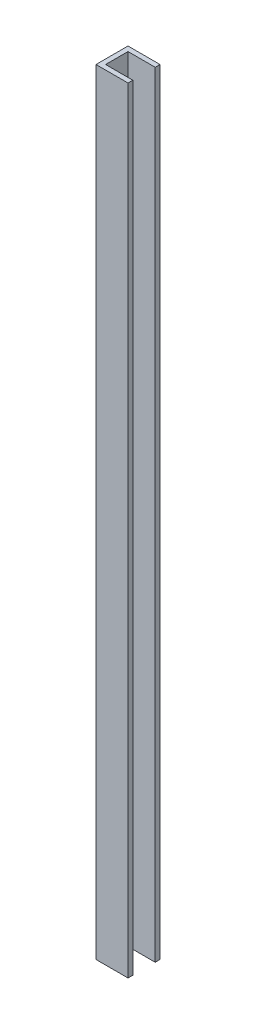
ISO-10303-21;
HEADER;
FILE_DESCRIPTION(('STEP AP214'),'2;1');
FILE_NAME('part.step','',(''),(''),'','','');
FILE_SCHEMA(('AUTOMOTIVE_DESIGN { 1 0 10303 214 1 1 1 1 }'));
ENDSEC;
DATA;
#1=APPLICATION_CONTEXT('core data for automotive mechanical design processes');
#2=APPLICATION_PROTOCOL_DEFINITION('international standard','automotive_design',2000,#1);
#3=PRODUCT_CONTEXT('',#1,'mechanical');
#4=PRODUCT('Part','Part','',(#3));
#5=PRODUCT_RELATED_PRODUCT_CATEGORY('part','',(#4));
#6=PRODUCT_DEFINITION_FORMATION('','',#4);
#7=PRODUCT_DEFINITION_CONTEXT('part definition',#1,'design');
#8=PRODUCT_DEFINITION('design','',#6,#7);
#9=PRODUCT_DEFINITION_SHAPE('','',#8);
#10=(LENGTH_UNIT() NAMED_UNIT(*) SI_UNIT(.MILLI.,.METRE.));
#11=(NAMED_UNIT(*) PLANE_ANGLE_UNIT() SI_UNIT($,.RADIAN.));
#12=(NAMED_UNIT(*) SI_UNIT($,.STERADIAN.) SOLID_ANGLE_UNIT());
#13=UNCERTAINTY_MEASURE_WITH_UNIT(LENGTH_MEASURE(1.E-05),#10,'distance_accuracy_value','');
#14=(GEOMETRIC_REPRESENTATION_CONTEXT(3) GLOBAL_UNCERTAINTY_ASSIGNED_CONTEXT((#13)) GLOBAL_UNIT_ASSIGNED_CONTEXT((#10,
#11,#12)) REPRESENTATION_CONTEXT('',''));
#15=CARTESIAN_POINT('',(0.,0.,0.));
#16=DIRECTION('',(0.,0.,1.));
#17=DIRECTION('',(1.,0.,0.));
#18=AXIS2_PLACEMENT_3D('',#15,#16,#17);
#19=CARTESIAN_POINT('',(-3.5,121.,0.));
#20=DIRECTION('',(1.,0.,0.));
#21=DIRECTION('',(0.,0.,-1.));
#22=AXIS2_PLACEMENT_3D('',#19,#20,#21);
#23=PLANE('',#22);
#24=DIRECTION('',(0.,0.,1.));
#25=VECTOR('',#24,1.);
#26=CARTESIAN_POINT('',(-3.5,-121.,0.));
#27=LINE('',#26,#25);
#28=CARTESIAN_POINT('',(-3.5,-121.,-3.50000000000002));
#29=VERTEX_POINT('',#28);
#30=CARTESIAN_POINT('',(-3.5,-121.,3.50000000000001));
#31=VERTEX_POINT('',#30);
#32=EDGE_CURVE('E195',#29,#31,#27,.T.);
#33=ORIENTED_EDGE('',*,*,#32,.F.);
#34=DIRECTION('',(0.,-1.,0.));
#35=VECTOR('',#34,1.);
#36=CARTESIAN_POINT('',(-3.5,121.,-3.50000000000002));
#37=LINE('',#36,#35);
#38=CARTESIAN_POINT('',(-3.5,121.,-3.50000000000002));
#39=VERTEX_POINT('',#38);
#40=EDGE_CURVE('E11',#39,#29,#37,.T.);
#41=ORIENTED_EDGE('',*,*,#40,.F.);
#42=DIRECTION('',(0.,0.,1.));
#43=VECTOR('',#42,1.);
#44=CARTESIAN_POINT('',(-3.5,121.,0.));
#45=LINE('',#44,#43);
#46=CARTESIAN_POINT('',(-3.5,121.,3.50000000000001));
#47=VERTEX_POINT('',#46);
#48=EDGE_CURVE('E151',#39,#47,#45,.T.);
#49=ORIENTED_EDGE('',*,*,#48,.T.);
#50=DIRECTION('',(0.,-1.,0.));
#51=VECTOR('',#50,1.);
#52=CARTESIAN_POINT('',(-3.5,121.,3.50000000000001));
#53=LINE('',#52,#51);
#54=EDGE_CURVE('E95',#47,#31,#53,.T.);
#55=ORIENTED_EDGE('',*,*,#54,.T.);
#56=EDGE_LOOP('',(#33,#41,#49,#55));
#57=FACE_BOUND('',#56,.T.);
#58=ADVANCED_FACE('F43',(#57),#23,.T.);
#59=CARTESIAN_POINT('',(0.,121.,-3.50000000000002));
#60=DIRECTION('',(0.,0.,1.));
#61=DIRECTION('',(1.,0.,0.));
#62=AXIS2_PLACEMENT_3D('',#59,#60,#61);
#63=PLANE('',#62);
#64=DIRECTION('',(-1.,0.,0.));
#65=VECTOR('',#64,1.);
#66=CARTESIAN_POINT('',(0.,-121.,-3.50000000000002));
#67=LINE('',#66,#65);
#68=CARTESIAN_POINT('',(5.,-121.,-3.50000000000002));
#69=VERTEX_POINT('',#68);
#70=EDGE_CURVE('E188',#69,#29,#67,.T.);
#71=ORIENTED_EDGE('',*,*,#70,.F.);
#72=DIRECTION('',(0.,-1.,0.));
#73=VECTOR('',#72,1.);
#74=CARTESIAN_POINT('',(5.,121.,-3.50000000000002));
#75=LINE('',#74,#73);
#76=CARTESIAN_POINT('',(5.,121.,-3.50000000000002));
#77=VERTEX_POINT('',#76);
#78=EDGE_CURVE('E52',#77,#69,#75,.T.);
#79=ORIENTED_EDGE('',*,*,#78,.F.);
#80=DIRECTION('',(-1.,0.,0.));
#81=VECTOR('',#80,1.);
#82=CARTESIAN_POINT('',(0.,121.,-3.50000000000002));
#83=LINE('',#82,#81);
#84=EDGE_CURVE('E143',#77,#39,#83,.T.);
#85=ORIENTED_EDGE('',*,*,#84,.T.);
#86=ORIENTED_EDGE('',*,*,#40,.T.);
#87=EDGE_LOOP('',(#71,#79,#85,#86));
#88=FACE_BOUND('',#87,.T.);
#89=ADVANCED_FACE('F193',(#88),#63,.T.);
#90=CARTESIAN_POINT('',(5.,121.,0.));
#91=DIRECTION('',(-1.,0.,0.));
#92=DIRECTION('',(0.,0.,1.));
#93=AXIS2_PLACEMENT_3D('',#90,#91,#92);
#94=PLANE('',#93);
#95=DIRECTION('',(0.,0.,-1.));
#96=VECTOR('',#95,1.);
#97=CARTESIAN_POINT('',(5.,-121.,0.));
#98=LINE('',#97,#96);
#99=CARTESIAN_POINT('',(5.,-121.,-5.00000000000002));
#100=VERTEX_POINT('',#99);
#101=EDGE_CURVE('E163',#69,#100,#98,.T.);
#102=ORIENTED_EDGE('',*,*,#101,.T.);
#103=DIRECTION('',(0.,-1.,0.));
#104=VECTOR('',#103,1.);
#105=CARTESIAN_POINT('',(5.,121.,-5.00000000000002));
#106=LINE('',#105,#104);
#107=CARTESIAN_POINT('',(5.,121.,-5.00000000000002));
#108=VERTEX_POINT('',#107);
#109=EDGE_CURVE('E176',#108,#100,#106,.T.);
#110=ORIENTED_EDGE('',*,*,#109,.F.);
#111=DIRECTION('',(0.,0.,-1.));
#112=VECTOR('',#111,1.);
#113=CARTESIAN_POINT('',(5.,121.,0.));
#114=LINE('',#113,#112);
#115=EDGE_CURVE('E136',#77,#108,#114,.T.);
#116=ORIENTED_EDGE('',*,*,#115,.F.);
#117=ORIENTED_EDGE('',*,*,#78,.T.);
#118=EDGE_LOOP('',(#102,#110,#116,#117));
#119=FACE_BOUND('',#118,.T.);
#120=ADVANCED_FACE('F182',(#119),#94,.F.);
#121=CARTESIAN_POINT('',(0.,121.,-5.00000000000002));
#122=DIRECTION('',(0.,0.,-1.));
#123=DIRECTION('',(-1.,0.,0.));
#124=AXIS2_PLACEMENT_3D('',#121,#122,#123);
#125=PLANE('',#124);
#126=DIRECTION('',(1.,0.,0.));
#127=VECTOR('',#126,1.);
#128=CARTESIAN_POINT('',(0.,-121.,-5.00000000000002));
#129=LINE('',#128,#127);
#130=CARTESIAN_POINT('',(-5.,-121.,-5.00000000000002));
#131=VERTEX_POINT('',#130);
#132=EDGE_CURVE('E191',#131,#100,#129,.T.);
#133=ORIENTED_EDGE('',*,*,#132,.F.);
#134=DIRECTION('',(0.,-1.,0.));
#135=VECTOR('',#134,1.);
#136=CARTESIAN_POINT('',(-5.,121.,-5.00000000000002));
#137=LINE('',#136,#135);
#138=CARTESIAN_POINT('',(-5.,121.,-5.00000000000002));
#139=VERTEX_POINT('',#138);
#140=EDGE_CURVE('E173',#139,#131,#137,.T.);
#141=ORIENTED_EDGE('',*,*,#140,.F.);
#142=DIRECTION('',(1.,0.,0.));
#143=VECTOR('',#142,1.);
#144=CARTESIAN_POINT('',(0.,121.,-5.00000000000002));
#145=LINE('',#144,#143);
#146=EDGE_CURVE('E142',#139,#108,#145,.T.);
#147=ORIENTED_EDGE('',*,*,#146,.T.);
#148=ORIENTED_EDGE('',*,*,#109,.T.);
#149=EDGE_LOOP('',(#133,#141,#147,#148));
#150=FACE_BOUND('',#149,.T.);
#151=ADVANCED_FACE('F208',(#150),#125,.T.);
#152=CARTESIAN_POINT('',(-5.,121.,0.));
#153=DIRECTION('',(-1.,0.,0.));
#154=DIRECTION('',(0.,0.,1.));
#155=AXIS2_PLACEMENT_3D('',#152,#153,#154);
#156=PLANE('',#155);
#157=DIRECTION('',(0.,0.,-1.));
#158=VECTOR('',#157,1.);
#159=CARTESIAN_POINT('',(-5.,-121.,0.));
#160=LINE('',#159,#158);
#161=CARTESIAN_POINT('',(-5.,-121.,5.00000000000002));
#162=VERTEX_POINT('',#161);
#163=EDGE_CURVE('E201',#162,#131,#160,.T.);
#164=ORIENTED_EDGE('',*,*,#163,.F.);
#165=DIRECTION('',(0.,-1.,0.));
#166=VECTOR('',#165,1.);
#167=CARTESIAN_POINT('',(-5.,121.,5.00000000000002));
#168=LINE('',#167,#166);
#169=CARTESIAN_POINT('',(-5.,121.,5.00000000000002));
#170=VERTEX_POINT('',#169);
#171=EDGE_CURVE('E130',#170,#162,#168,.T.);
#172=ORIENTED_EDGE('',*,*,#171,.F.);
#173=DIRECTION('',(0.,0.,-1.));
#174=VECTOR('',#173,1.);
#175=CARTESIAN_POINT('',(-5.,121.,0.));
#176=LINE('',#175,#174);
#177=EDGE_CURVE('E121',#170,#139,#176,.T.);
#178=ORIENTED_EDGE('',*,*,#177,.T.);
#179=ORIENTED_EDGE('',*,*,#140,.T.);
#180=EDGE_LOOP('',(#164,#172,#178,#179));
#181=FACE_BOUND('',#180,.T.);
#182=ADVANCED_FACE('F206',(#181),#156,.T.);
#183=CARTESIAN_POINT('',(0.,121.,5.00000000000002));
#184=DIRECTION('',(0.,0.,-1.));
#185=DIRECTION('',(-1.,0.,0.));
#186=AXIS2_PLACEMENT_3D('',#183,#184,#185);
#187=PLANE('',#186);
#188=DIRECTION('',(1.,0.,0.));
#189=VECTOR('',#188,1.);
#190=CARTESIAN_POINT('',(0.,-121.,5.00000000000002));
#191=LINE('',#190,#189);
#192=CARTESIAN_POINT('',(5.,-121.,5.00000000000002));
#193=VERTEX_POINT('',#192);
#194=EDGE_CURVE('E128',#162,#193,#191,.T.);
#195=ORIENTED_EDGE('',*,*,#194,.T.);
#196=DIRECTION('',(0.,-1.,0.));
#197=VECTOR('',#196,1.);
#198=CARTESIAN_POINT('',(5.,121.,5.00000000000002));
#199=LINE('',#198,#197);
#200=CARTESIAN_POINT('',(5.,121.,5.00000000000002));
#201=VERTEX_POINT('',#200);
#202=EDGE_CURVE('E125',#201,#193,#199,.T.);
#203=ORIENTED_EDGE('',*,*,#202,.F.);
#204=DIRECTION('',(1.,0.,0.));
#205=VECTOR('',#204,1.);
#206=CARTESIAN_POINT('',(0.,121.,5.00000000000002));
#207=LINE('',#206,#205);
#208=EDGE_CURVE('E114',#170,#201,#207,.T.);
#209=ORIENTED_EDGE('',*,*,#208,.F.);
#210=ORIENTED_EDGE('',*,*,#171,.T.);
#211=EDGE_LOOP('',(#195,#203,#209,#210));
#212=FACE_BOUND('',#211,.T.);
#213=ADVANCED_FACE('F126',(#212),#187,.F.);
#214=CARTESIAN_POINT('',(5.,-121.,3.50000000000001));
#215=VERTEX_POINT('',#214);
#216=EDGE_CURVE('E88',#193,#215,#98,.T.);
#217=ORIENTED_EDGE('',*,*,#216,.T.);
#218=DIRECTION('',(0.,-1.,0.));
#219=VECTOR('',#218,1.);
#220=CARTESIAN_POINT('',(5.,121.,3.50000000000001));
#221=LINE('',#220,#219);
#222=CARTESIAN_POINT('',(5.,121.,3.50000000000001));
#223=VERTEX_POINT('',#222);
#224=EDGE_CURVE('E131',#223,#215,#221,.T.);
#225=ORIENTED_EDGE('',*,*,#224,.F.);
#226=EDGE_CURVE('E118',#201,#223,#114,.T.);
#227=ORIENTED_EDGE('',*,*,#226,.F.);
#228=ORIENTED_EDGE('',*,*,#202,.T.);
#229=EDGE_LOOP('',(#217,#225,#227,#228));
#230=FACE_BOUND('',#229,.T.);
#231=ADVANCED_FACE('F133',(#230),#94,.F.);
#232=CARTESIAN_POINT('',(0.,121.,3.50000000000001));
#233=DIRECTION('',(0.,0.,1.));
#234=DIRECTION('',(1.,0.,0.));
#235=AXIS2_PLACEMENT_3D('',#232,#233,#234);
#236=PLANE('',#235);
#237=DIRECTION('',(-1.,0.,0.));
#238=VECTOR('',#237,1.);
#239=CARTESIAN_POINT('',(0.,-121.,3.50000000000001));
#240=LINE('',#239,#238);
#241=EDGE_CURVE('E154',#215,#31,#240,.T.);
#242=ORIENTED_EDGE('',*,*,#241,.T.);
#243=ORIENTED_EDGE('',*,*,#54,.F.);
#244=DIRECTION('',(-1.,0.,0.));
#245=VECTOR('',#244,1.);
#246=CARTESIAN_POINT('',(0.,121.,3.50000000000001));
#247=LINE('',#246,#245);
#248=EDGE_CURVE('E60',#223,#47,#247,.T.);
#249=ORIENTED_EDGE('',*,*,#248,.F.);
#250=ORIENTED_EDGE('',*,*,#224,.T.);
#251=EDGE_LOOP('',(#242,#243,#249,#250));
#252=FACE_BOUND('',#251,.T.);
#253=ADVANCED_FACE('F258',(#252),#236,.F.);
#254=CARTESIAN_POINT('',(0.,121.,0.));
#255=DIRECTION('',(0.,1.,0.));
#256=DIRECTION('',(0.,0.,1.));
#257=AXIS2_PLACEMENT_3D('',#254,#255,#256);
#258=PLANE('',#257);
#259=ORIENTED_EDGE('',*,*,#48,.F.);
#260=ORIENTED_EDGE('',*,*,#84,.F.);
#261=ORIENTED_EDGE('',*,*,#115,.T.);
#262=ORIENTED_EDGE('',*,*,#146,.F.);
#263=ORIENTED_EDGE('',*,*,#177,.F.);
#264=ORIENTED_EDGE('',*,*,#208,.T.);
#265=ORIENTED_EDGE('',*,*,#226,.T.);
#266=ORIENTED_EDGE('',*,*,#248,.T.);
#267=EDGE_LOOP('',(#259,#260,#261,#262,#263,#264,#265,#266));
#268=FACE_BOUND('',#267,.T.);
#269=ADVANCED_FACE('F116',(#268),#258,.T.);
#270=CARTESIAN_POINT('',(0.,-121.,0.));
#271=DIRECTION('',(0.,1.,0.));
#272=DIRECTION('',(0.,0.,1.));
#273=AXIS2_PLACEMENT_3D('',#270,#271,#272);
#274=PLANE('',#273);
#275=ORIENTED_EDGE('',*,*,#32,.T.);
#276=ORIENTED_EDGE('',*,*,#241,.F.);
#277=ORIENTED_EDGE('',*,*,#216,.F.);
#278=ORIENTED_EDGE('',*,*,#194,.F.);
#279=ORIENTED_EDGE('',*,*,#163,.T.);
#280=ORIENTED_EDGE('',*,*,#132,.T.);
#281=ORIENTED_EDGE('',*,*,#101,.F.);
#282=ORIENTED_EDGE('',*,*,#70,.T.);
#283=EDGE_LOOP('',(#275,#276,#277,#278,#279,#280,#281,#282));
#284=FACE_BOUND('',#283,.T.);
#285=ADVANCED_FACE('F187',(#284),#274,.F.);
#286=CLOSED_SHELL('',(#58,#89,#120,#151,#182,#213,#231,#253,#269,#285));
#287=MANIFOLD_SOLID_BREP('B2',#286);
#288=ADVANCED_BREP_SHAPE_REPRESENTATION('',(#18,#287),#14);
#289=SHAPE_DEFINITION_REPRESENTATION(#9,#288);
ENDSEC;
END-ISO-10303-21;
